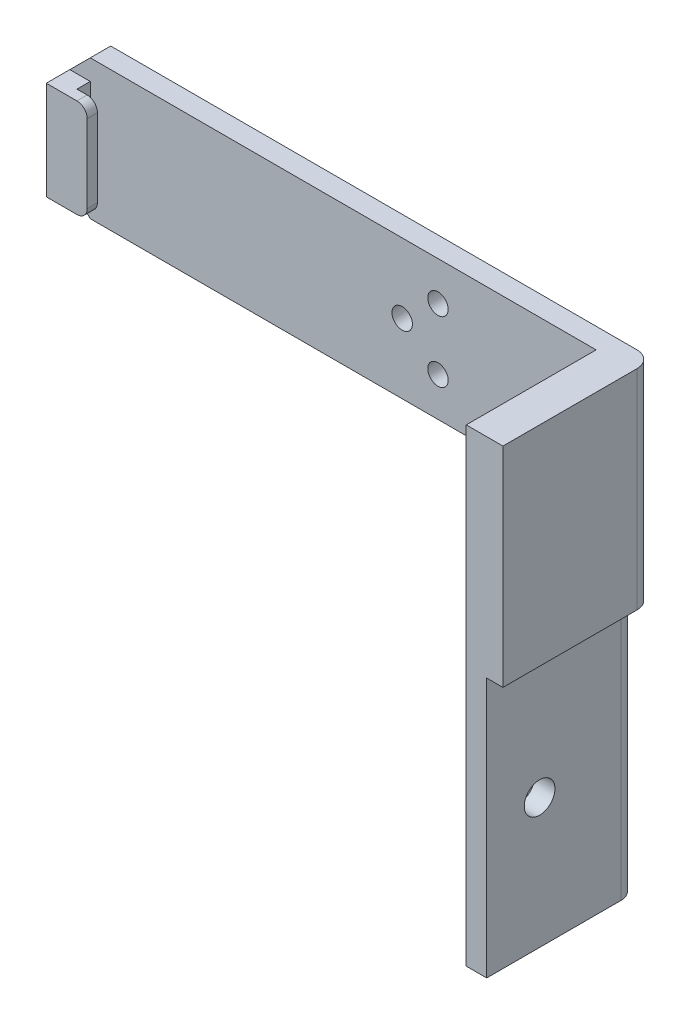
ISO-10303-21;
HEADER;
FILE_DESCRIPTION(('STEP AP214'),'2;1');
FILE_NAME('part.step','',(''),(''),'','','');
FILE_SCHEMA(('AUTOMOTIVE_DESIGN { 1 0 10303 214 1 1 1 1 }'));
ENDSEC;
DATA;
#1=APPLICATION_CONTEXT('core data for automotive mechanical design processes');
#2=APPLICATION_PROTOCOL_DEFINITION('international standard','automotive_design',2000,#1);
#3=PRODUCT_CONTEXT('',#1,'mechanical');
#4=PRODUCT('Part','Part','',(#3));
#5=PRODUCT_RELATED_PRODUCT_CATEGORY('part','',(#4));
#6=PRODUCT_DEFINITION_FORMATION('','',#4);
#7=PRODUCT_DEFINITION_CONTEXT('part definition',#1,'design');
#8=PRODUCT_DEFINITION('design','',#6,#7);
#9=PRODUCT_DEFINITION_SHAPE('','',#8);
#10=(LENGTH_UNIT() NAMED_UNIT(*) SI_UNIT(.MILLI.,.METRE.));
#11=(NAMED_UNIT(*) PLANE_ANGLE_UNIT() SI_UNIT($,.RADIAN.));
#12=(NAMED_UNIT(*) SI_UNIT($,.STERADIAN.) SOLID_ANGLE_UNIT());
#13=UNCERTAINTY_MEASURE_WITH_UNIT(LENGTH_MEASURE(1.E-05),#10,'distance_accuracy_value','');
#14=(GEOMETRIC_REPRESENTATION_CONTEXT(3) GLOBAL_UNCERTAINTY_ASSIGNED_CONTEXT((#13)) GLOBAL_UNIT_ASSIGNED_CONTEXT((#10,
#11,#12)) REPRESENTATION_CONTEXT('',''));
#15=CARTESIAN_POINT('',(0.,0.,0.));
#16=DIRECTION('',(0.,0.,1.));
#17=DIRECTION('',(1.,0.,0.));
#18=AXIS2_PLACEMENT_3D('',#15,#16,#17);
#19=CARTESIAN_POINT('',(106.925,-64.425,4.));
#20=DIRECTION('',(-1.,0.,0.));
#21=DIRECTION('',(0.,0.,1.));
#22=AXIS2_PLACEMENT_3D('',#19,#20,#21);
#23=PLANE('',#22);
#24=CARTESIAN_POINT('',(106.925,-39.025,19.05));
#25=DIRECTION('',(-1.,0.,0.));
#26=DIRECTION('',(0.,0.,1.));
#27=AXIS2_PLACEMENT_3D('',#24,#25,#26);
#28=CIRCLE('',#27,3.);
#29=CARTESIAN_POINT('',(106.925,-39.025,22.05));
#30=VERTEX_POINT('',#29);
#31=EDGE_CURVE('E210',#30,#30,#28,.F.);
#32=ORIENTED_EDGE('',*,*,#31,.F.);
#33=EDGE_LOOP('',(#32));
#34=FACE_BOUND('',#33,.T.);
#35=DIRECTION('',(0.,0.,-1.));
#36=VECTOR('',#35,1.);
#37=CARTESIAN_POINT('',(106.925,-64.425,4.));
#38=LINE('',#37,#36);
#39=CARTESIAN_POINT('',(106.925,-64.425,29.4));
#40=VERTEX_POINT('',#39);
#41=CARTESIAN_POINT('',(106.925,-64.425,3.175));
#42=VERTEX_POINT('',#41);
#43=EDGE_CURVE('E301',#40,#42,#38,.T.);
#44=ORIENTED_EDGE('',*,*,#43,.T.);
#45=DIRECTION('',(0.,1.,0.));
#46=VECTOR('',#45,1.);
#47=CARTESIAN_POINT('',(106.925,-13.625,3.175));
#48=LINE('',#47,#46);
#49=CARTESIAN_POINT('',(106.925,-13.625,3.175));
#50=VERTEX_POINT('',#49);
#51=EDGE_CURVE('E360',#42,#50,#48,.T.);
#52=ORIENTED_EDGE('',*,*,#51,.T.);
#53=DIRECTION('',(0.,0.,-1.));
#54=VECTOR('',#53,1.);
#55=CARTESIAN_POINT('',(106.925,-13.625,29.4));
#56=LINE('',#55,#54);
#57=CARTESIAN_POINT('',(106.925,-13.625,29.4));
#58=VERTEX_POINT('',#57);
#59=EDGE_CURVE('E201',#58,#50,#56,.T.);
#60=ORIENTED_EDGE('',*,*,#59,.F.);
#61=DIRECTION('',(0.,-1.,0.));
#62=VECTOR('',#61,1.);
#63=CARTESIAN_POINT('',(106.925,27.25,29.4));
#64=LINE('',#63,#62);
#65=EDGE_CURVE('E206',#58,#40,#64,.T.);
#66=ORIENTED_EDGE('',*,*,#65,.T.);
#67=EDGE_LOOP('',(#44,#52,#60,#66));
#68=FACE_BOUND('',#67,.T.);
#69=ADVANCED_FACE('F42',(#34,#68),#23,.F.);
#70=CARTESIAN_POINT('',(4.,23.25,6.6));
#71=DIRECTION('',(1.,0.,0.));
#72=DIRECTION('',(0.,1.,0.));
#73=AXIS2_PLACEMENT_3D('',#70,#71,#72);
#74=PLANE('',#73);
#75=DIRECTION('',(0.,0.,-1.));
#76=VECTOR('',#75,1.);
#77=CARTESIAN_POINT('',(4.,23.25,6.6));
#78=LINE('',#77,#76);
#79=CARTESIAN_POINT('',(4.,23.25,6.5999));
#80=VERTEX_POINT('',#79);
#81=CARTESIAN_POINT('',(4.,23.25,4.));
#82=VERTEX_POINT('',#81);
#83=EDGE_CURVE('E246',#80,#82,#78,.T.);
#84=ORIENTED_EDGE('',*,*,#83,.F.);
#85=DIRECTION('',(0.,-1.,0.));
#86=VECTOR('',#85,1.);
#87=CARTESIAN_POINT('',(4.,23.25,6.5999));
#88=LINE('',#87,#86);
#89=CARTESIAN_POINT('',(4.,4.,6.5999));
#90=VERTEX_POINT('',#89);
#91=EDGE_CURVE('E236',#80,#90,#88,.T.);
#92=ORIENTED_EDGE('',*,*,#91,.T.);
#93=DIRECTION('',(0.,0.,-1.));
#94=VECTOR('',#93,1.);
#95=CARTESIAN_POINT('',(4.,4.,6.6));
#96=LINE('',#95,#94);
#97=CARTESIAN_POINT('',(4.,4.,4.));
#98=VERTEX_POINT('',#97);
#99=EDGE_CURVE('E244',#90,#98,#96,.T.);
#100=ORIENTED_EDGE('',*,*,#99,.T.);
#101=DIRECTION('',(0.,-1.,0.));
#102=VECTOR('',#101,1.);
#103=CARTESIAN_POINT('',(4.,0.,4.));
#104=LINE('',#103,#102);
#105=EDGE_CURVE('E320',#82,#98,#104,.T.);
#106=ORIENTED_EDGE('',*,*,#105,.F.);
#107=EDGE_LOOP('',(#84,#92,#100,#106));
#108=FACE_BOUND('',#107,.T.);
#109=ADVANCED_FACE('F387',(#108),#74,.T.);
#110=CARTESIAN_POINT('',(0.,0.,4.));
#111=DIRECTION('',(0.,0.,-1.));
#112=DIRECTION('',(-1.,0.,0.));
#113=AXIS2_PLACEMENT_3D('',#110,#111,#112);
#114=PLANE('',#113);
#115=DIRECTION('',(-1.,0.,0.));
#116=VECTOR('',#115,1.);
#117=CARTESIAN_POINT('',(0.,4.,4.));
#118=LINE('',#117,#116);
#119=CARTESIAN_POINT('',(0.,4.,4.));
#120=VERTEX_POINT('',#119);
#121=EDGE_CURVE('E252',#98,#120,#118,.T.);
#122=ORIENTED_EDGE('',*,*,#121,.T.);
#123=DIRECTION('',(-0.707106781186548,0.707106781186548,0.));
#124=VECTOR('',#123,1.);
#125=CARTESIAN_POINT('',(4.,0.,4.));
#126=LINE('',#125,#124);
#127=CARTESIAN_POINT('',(4.,0.,4.));
#128=VERTEX_POINT('',#127);
#129=EDGE_CURVE('E356',#120,#128,#126,.F.);
#130=ORIENTED_EDGE('',*,*,#129,.T.);
#131=DIRECTION('',(1.,0.,0.));
#132=VECTOR('',#131,1.);
#133=CARTESIAN_POINT('',(0.,0.,4.));
#134=LINE('',#133,#132);
#135=CARTESIAN_POINT('',(81.525,0.,4.));
#136=VERTEX_POINT('',#135);
#137=EDGE_CURVE('E291',#128,#136,#134,.T.);
#138=ORIENTED_EDGE('',*,*,#137,.T.);
#139=DIRECTION('',(0.,-1.,0.));
#140=VECTOR('',#139,1.);
#141=CARTESIAN_POINT('',(81.525,0.,4.));
#142=LINE('',#141,#140);
#143=CARTESIAN_POINT('',(81.525,-64.425,4.));
#144=VERTEX_POINT('',#143);
#145=EDGE_CURVE('E293',#136,#144,#142,.T.);
#146=ORIENTED_EDGE('',*,*,#145,.T.);
#147=DIRECTION('',(1.,0.,0.));
#148=VECTOR('',#147,1.);
#149=CARTESIAN_POINT('',(81.525,-64.425,4.));
#150=LINE('',#149,#148);
#151=CARTESIAN_POINT('',(102.925,-64.425,4.));
#152=VERTEX_POINT('',#151);
#153=EDGE_CURVE('E296',#144,#152,#150,.T.);
#154=ORIENTED_EDGE('',*,*,#153,.T.);
#155=DIRECTION('',(0.,1.,0.));
#156=VECTOR('',#155,1.);
#157=CARTESIAN_POINT('',(102.925,0.,4.));
#158=LINE('',#157,#156);
#159=CARTESIAN_POINT('',(102.925,27.25,4.));
#160=VERTEX_POINT('',#159);
#161=EDGE_CURVE('E268',#152,#160,#158,.T.);
#162=ORIENTED_EDGE('',*,*,#161,.T.);
#163=DIRECTION('',(-1.,0.,0.));
#164=VECTOR('',#163,1.);
#165=CARTESIAN_POINT('',(0.,27.25,4.));
#166=LINE('',#165,#164);
#167=CARTESIAN_POINT('',(3.99999999999999,27.25,4.));
#168=VERTEX_POINT('',#167);
#169=EDGE_CURVE('E298',#160,#168,#166,.T.);
#170=ORIENTED_EDGE('',*,*,#169,.T.);
#171=DIRECTION('',(0.707106781186549,0.707106781186546,0.));
#172=VECTOR('',#171,1.);
#173=CARTESIAN_POINT('',(0.,23.25,4.));
#174=LINE('',#173,#172);
#175=CARTESIAN_POINT('',(0.,23.25,4.));
#176=VERTEX_POINT('',#175);
#177=EDGE_CURVE('E354',#168,#176,#174,.F.);
#178=ORIENTED_EDGE('',*,*,#177,.T.);
#179=DIRECTION('',(1.,0.,0.));
#180=VECTOR('',#179,1.);
#181=CARTESIAN_POINT('',(0.,23.25,4.));
#182=LINE('',#181,#180);
#183=EDGE_CURVE('E243',#176,#82,#182,.T.);
#184=ORIENTED_EDGE('',*,*,#183,.T.);
#185=ORIENTED_EDGE('',*,*,#105,.T.);
#186=EDGE_LOOP('',(#122,#130,#138,#146,#154,#162,#170,#178,#184,#185));
#187=FACE_BOUND('',#186,.T.);
#188=CARTESIAN_POINT('',(72.,19.625,4.));
#189=DIRECTION('',(0.,0.,1.));
#190=DIRECTION('',(1.,0.,0.));
#191=AXIS2_PLACEMENT_3D('',#188,#189,#190);
#192=CIRCLE('',#191,2.);
#193=CARTESIAN_POINT('',(74.,19.625,4.));
#194=VERTEX_POINT('',#193);
#195=EDGE_CURVE('E285',#194,#194,#192,.T.);
#196=ORIENTED_EDGE('',*,*,#195,.F.);
#197=EDGE_LOOP('',(#196));
#198=FACE_BOUND('',#197,.T.);
#199=CARTESIAN_POINT('',(72.,7.625,4.));
#200=DIRECTION('',(0.,0.,1.));
#201=DIRECTION('',(1.,0.,0.));
#202=AXIS2_PLACEMENT_3D('',#199,#200,#201);
#203=CIRCLE('',#202,2.);
#204=CARTESIAN_POINT('',(74.,7.625,4.));
#205=VERTEX_POINT('',#204);
#206=EDGE_CURVE('E279',#205,#205,#203,.T.);
#207=ORIENTED_EDGE('',*,*,#206,.F.);
#208=EDGE_LOOP('',(#207));
#209=FACE_BOUND('',#208,.T.);
#210=CARTESIAN_POINT('',(65.,13.625,4.));
#211=DIRECTION('',(0.,0.,1.));
#212=DIRECTION('',(1.,0.,0.));
#213=AXIS2_PLACEMENT_3D('',#210,#211,#212);
#214=CIRCLE('',#213,2.);
#215=CARTESIAN_POINT('',(67.,13.625,4.));
#216=VERTEX_POINT('',#215);
#217=EDGE_CURVE('E273',#216,#216,#214,.T.);
#218=ORIENTED_EDGE('',*,*,#217,.F.);
#219=EDGE_LOOP('',(#218));
#220=FACE_BOUND('',#219,.T.);
#221=ADVANCED_FACE('F395',(#187,#198,#209,#220),#114,.F.);
#222=CARTESIAN_POINT('',(0.,0.,0.));
#223=DIRECTION('',(0.,0.,-1.));
#224=DIRECTION('',(-1.,0.,0.));
#225=AXIS2_PLACEMENT_3D('',#222,#223,#224);
#226=PLANE('',#225);
#227=CARTESIAN_POINT('',(72.,7.625,0.));
#228=DIRECTION('',(0.,0.,1.));
#229=DIRECTION('',(1.,0.,0.));
#230=AXIS2_PLACEMENT_3D('',#227,#228,#229);
#231=CIRCLE('',#230,2.);
#232=CARTESIAN_POINT('',(74.,7.625,0.));
#233=VERTEX_POINT('',#232);
#234=EDGE_CURVE('E276',#233,#233,#231,.T.);
#235=ORIENTED_EDGE('',*,*,#234,.T.);
#236=EDGE_LOOP('',(#235));
#237=FACE_BOUND('',#236,.T.);
#238=DIRECTION('',(-1.,0.,0.));
#239=VECTOR('',#238,1.);
#240=CARTESIAN_POINT('',(110.1,-13.625,0.));
#241=LINE('',#240,#239);
#242=CARTESIAN_POINT('',(106.925,-13.625,0.));
#243=VERTEX_POINT('',#242);
#244=CARTESIAN_POINT('',(103.75,-13.625,0.));
#245=VERTEX_POINT('',#244);
#246=EDGE_CURVE('E56',#243,#245,#241,.T.);
#247=ORIENTED_EDGE('',*,*,#246,.T.);
#248=DIRECTION('',(0.,1.,0.));
#249=VECTOR('',#248,1.);
#250=CARTESIAN_POINT('',(103.75,-64.425,0.));
#251=LINE('',#250,#249);
#252=CARTESIAN_POINT('',(103.75,-64.425,0.));
#253=VERTEX_POINT('',#252);
#254=EDGE_CURVE('E366',#245,#253,#251,.F.);
#255=ORIENTED_EDGE('',*,*,#254,.T.);
#256=DIRECTION('',(1.,0.,0.));
#257=VECTOR('',#256,1.);
#258=CARTESIAN_POINT('',(81.525,-64.425,0.));
#259=LINE('',#258,#257);
#260=CARTESIAN_POINT('',(81.525,-64.425,0.));
#261=VERTEX_POINT('',#260);
#262=EDGE_CURVE('E308',#261,#253,#259,.T.);
#263=ORIENTED_EDGE('',*,*,#262,.F.);
#264=DIRECTION('',(0.,-1.,0.));
#265=VECTOR('',#264,1.);
#266=CARTESIAN_POINT('',(81.525,0.,0.));
#267=LINE('',#266,#265);
#268=CARTESIAN_POINT('',(81.525,0.,0.));
#269=VERTEX_POINT('',#268);
#270=EDGE_CURVE('E306',#269,#261,#267,.T.);
#271=ORIENTED_EDGE('',*,*,#270,.F.);
#272=DIRECTION('',(1.,0.,0.));
#273=VECTOR('',#272,1.);
#274=CARTESIAN_POINT('',(0.,0.,0.));
#275=LINE('',#274,#273);
#276=CARTESIAN_POINT('',(4.,0.,0.));
#277=VERTEX_POINT('',#276);
#278=EDGE_CURVE('E304',#277,#269,#275,.T.);
#279=ORIENTED_EDGE('',*,*,#278,.F.);
#280=DIRECTION('',(0.707106781186548,-0.707106781186548,0.));
#281=VECTOR('',#280,1.);
#282=CARTESIAN_POINT('',(2.,2.,0.));
#283=LINE('',#282,#281);
#284=CARTESIAN_POINT('',(0.,4.,0.));
#285=VERTEX_POINT('',#284);
#286=EDGE_CURVE('E347',#277,#285,#283,.F.);
#287=ORIENTED_EDGE('',*,*,#286,.T.);
#288=DIRECTION('',(0.,-1.,0.));
#289=VECTOR('',#288,1.);
#290=CARTESIAN_POINT('',(0.,0.,0.));
#291=LINE('',#290,#289);
#292=CARTESIAN_POINT('',(0.,23.25,0.));
#293=VERTEX_POINT('',#292);
#294=EDGE_CURVE('E288',#293,#285,#291,.T.);
#295=ORIENTED_EDGE('',*,*,#294,.F.);
#296=DIRECTION('',(-0.707106781186549,-0.707106781186546,0.));
#297=VECTOR('',#296,1.);
#298=CARTESIAN_POINT('',(-11.625,11.6250000000001,0.));
#299=LINE('',#298,#297);
#300=CARTESIAN_POINT('',(3.99999999999999,27.25,0.));
#301=VERTEX_POINT('',#300);
#302=EDGE_CURVE('E344',#293,#301,#299,.F.);
#303=ORIENTED_EDGE('',*,*,#302,.T.);
#304=DIRECTION('',(-1.,0.,0.));
#305=VECTOR('',#304,1.);
#306=CARTESIAN_POINT('',(0.,27.25,0.));
#307=LINE('',#306,#305);
#308=CARTESIAN_POINT('',(106.925,27.25,0.));
#309=VERTEX_POINT('',#308);
#310=EDGE_CURVE('E294',#309,#301,#307,.T.);
#311=ORIENTED_EDGE('',*,*,#310,.F.);
#312=DIRECTION('',(0.,1.,0.));
#313=VECTOR('',#312,1.);
#314=CARTESIAN_POINT('',(106.925,0.,0.));
#315=LINE('',#314,#313);
#316=EDGE_CURVE('E363',#309,#243,#315,.F.);
#317=ORIENTED_EDGE('',*,*,#316,.T.);
#318=EDGE_LOOP('',(#247,#255,#263,#271,#279,#287,#295,#303,#311,#317));
#319=FACE_BOUND('',#318,.T.);
#320=CARTESIAN_POINT('',(72.,19.625,0.));
#321=DIRECTION('',(0.,0.,1.));
#322=DIRECTION('',(1.,0.,0.));
#323=AXIS2_PLACEMENT_3D('',#320,#321,#322);
#324=CIRCLE('',#323,2.);
#325=CARTESIAN_POINT('',(74.,19.625,0.));
#326=VERTEX_POINT('',#325);
#327=EDGE_CURVE('E282',#326,#326,#324,.T.);
#328=ORIENTED_EDGE('',*,*,#327,.T.);
#329=EDGE_LOOP('',(#328));
#330=FACE_BOUND('',#329,.T.);
#331=CARTESIAN_POINT('',(65.,13.625,0.));
#332=DIRECTION('',(0.,0.,1.));
#333=DIRECTION('',(1.,0.,0.));
#334=AXIS2_PLACEMENT_3D('',#331,#332,#333);
#335=CIRCLE('',#334,2.);
#336=CARTESIAN_POINT('',(67.,13.625,0.));
#337=VERTEX_POINT('',#336);
#338=EDGE_CURVE('E272',#337,#337,#335,.T.);
#339=ORIENTED_EDGE('',*,*,#338,.T.);
#340=EDGE_LOOP('',(#339));
#341=FACE_BOUND('',#340,.T.);
#342=ADVANCED_FACE('F376',(#237,#319,#330,#341),#226,.T.);
#343=CARTESIAN_POINT('',(0.,0.,4.));
#344=DIRECTION('',(1.,0.,0.));
#345=DIRECTION('',(0.,0.,-1.));
#346=AXIS2_PLACEMENT_3D('',#343,#344,#345);
#347=PLANE('',#346);
#348=ORIENTED_EDGE('',*,*,#294,.T.);
#349=DIRECTION('',(0.,0.,1.));
#350=VECTOR('',#349,1.);
#351=CARTESIAN_POINT('',(0.,4.,4.));
#352=LINE('',#351,#350);
#353=EDGE_CURVE('E352',#285,#120,#352,.T.);
#354=ORIENTED_EDGE('',*,*,#353,.T.);
#355=DIRECTION('',(0.,0.,-1.));
#356=VECTOR('',#355,1.);
#357=CARTESIAN_POINT('',(0.,4.,6.6));
#358=LINE('',#357,#356);
#359=CARTESIAN_POINT('',(0.,4.,8.6));
#360=VERTEX_POINT('',#359);
#361=EDGE_CURVE('E240',#360,#120,#358,.T.);
#362=ORIENTED_EDGE('',*,*,#361,.F.);
#363=DIRECTION('',(0.,1.,0.));
#364=VECTOR('',#363,1.);
#365=CARTESIAN_POINT('',(0.,23.25,8.6));
#366=LINE('',#365,#364);
#367=CARTESIAN_POINT('',(0.,23.25,8.6));
#368=VERTEX_POINT('',#367);
#369=EDGE_CURVE('E225',#360,#368,#366,.T.);
#370=ORIENTED_EDGE('',*,*,#369,.T.);
#371=DIRECTION('',(0.,0.,-1.));
#372=VECTOR('',#371,1.);
#373=CARTESIAN_POINT('',(0.,23.25,6.6));
#374=LINE('',#373,#372);
#375=EDGE_CURVE('E239',#368,#176,#374,.T.);
#376=ORIENTED_EDGE('',*,*,#375,.T.);
#377=DIRECTION('',(0.,0.,-1.));
#378=VECTOR('',#377,1.);
#379=CARTESIAN_POINT('',(0.,23.25,4.));
#380=LINE('',#379,#378);
#381=EDGE_CURVE('E349',#176,#293,#380,.T.);
#382=ORIENTED_EDGE('',*,*,#381,.T.);
#383=EDGE_LOOP('',(#348,#354,#362,#370,#376,#382));
#384=FACE_BOUND('',#383,.T.);
#385=ADVANCED_FACE('F414',(#384),#347,.F.);
#386=CARTESIAN_POINT('',(0.,0.,4.));
#387=DIRECTION('',(0.,1.,0.));
#388=DIRECTION('',(0.,0.,1.));
#389=AXIS2_PLACEMENT_3D('',#386,#387,#388);
#390=PLANE('',#389);
#391=ORIENTED_EDGE('',*,*,#137,.F.);
#392=DIRECTION('',(0.,0.,-1.));
#393=VECTOR('',#392,1.);
#394=CARTESIAN_POINT('',(4.,0.,4.));
#395=LINE('',#394,#393);
#396=EDGE_CURVE('E341',#128,#277,#395,.T.);
#397=ORIENTED_EDGE('',*,*,#396,.T.);
#398=ORIENTED_EDGE('',*,*,#278,.T.);
#399=DIRECTION('',(0.,0.,-1.));
#400=VECTOR('',#399,1.);
#401=CARTESIAN_POINT('',(81.525,0.,4.));
#402=LINE('',#401,#400);
#403=EDGE_CURVE('E317',#136,#269,#402,.T.);
#404=ORIENTED_EDGE('',*,*,#403,.F.);
#405=EDGE_LOOP('',(#391,#397,#398,#404));
#406=FACE_BOUND('',#405,.T.);
#407=ADVANCED_FACE('F410',(#406),#390,.F.);
#408=CARTESIAN_POINT('',(81.525,0.,4.));
#409=DIRECTION('',(1.,0.,0.));
#410=DIRECTION('',(0.,0.,-1.));
#411=AXIS2_PLACEMENT_3D('',#408,#409,#410);
#412=PLANE('',#411);
#413=ORIENTED_EDGE('',*,*,#270,.T.);
#414=DIRECTION('',(0.,0.,-1.));
#415=VECTOR('',#414,1.);
#416=CARTESIAN_POINT('',(81.525,-64.425,4.));
#417=LINE('',#416,#415);
#418=EDGE_CURVE('E314',#144,#261,#417,.T.);
#419=ORIENTED_EDGE('',*,*,#418,.F.);
#420=ORIENTED_EDGE('',*,*,#145,.F.);
#421=ORIENTED_EDGE('',*,*,#403,.T.);
#422=EDGE_LOOP('',(#413,#419,#420,#421));
#423=FACE_BOUND('',#422,.T.);
#424=ADVANCED_FACE('F406',(#423),#412,.F.);
#425=CARTESIAN_POINT('',(81.525,-64.425,4.));
#426=DIRECTION('',(0.,1.,0.));
#427=DIRECTION('',(0.,0.,1.));
#428=AXIS2_PLACEMENT_3D('',#425,#426,#427);
#429=PLANE('',#428);
#430=ORIENTED_EDGE('',*,*,#262,.T.);
#431=CARTESIAN_POINT('',(103.75,-64.425,3.175));
#432=DIRECTION('',(0.,1.,0.));
#433=DIRECTION('',(0.,0.,1.));
#434=AXIS2_PLACEMENT_3D('',#431,#432,#433);
#435=CIRCLE('',#434,3.175);
#436=EDGE_CURVE('E368',#253,#42,#435,.F.);
#437=ORIENTED_EDGE('',*,*,#436,.T.);
#438=ORIENTED_EDGE('',*,*,#43,.F.);
#439=DIRECTION('',(-1.,0.,0.));
#440=VECTOR('',#439,1.);
#441=CARTESIAN_POINT('',(106.925,-64.425,29.4));
#442=LINE('',#441,#440);
#443=CARTESIAN_POINT('',(102.925,-64.425,29.4));
#444=VERTEX_POINT('',#443);
#445=EDGE_CURVE('E256',#40,#444,#442,.T.);
#446=ORIENTED_EDGE('',*,*,#445,.T.);
#447=DIRECTION('',(0.,0.,-1.));
#448=VECTOR('',#447,1.);
#449=CARTESIAN_POINT('',(102.925,-64.425,29.4));
#450=LINE('',#449,#448);
#451=EDGE_CURVE('E264',#444,#152,#450,.T.);
#452=ORIENTED_EDGE('',*,*,#451,.T.);
#453=ORIENTED_EDGE('',*,*,#153,.F.);
#454=ORIENTED_EDGE('',*,*,#418,.T.);
#455=EDGE_LOOP('',(#430,#437,#438,#446,#452,#453,#454));
#456=FACE_BOUND('',#455,.T.);
#457=ADVANCED_FACE('F403',(#456),#429,.F.);
#458=CARTESIAN_POINT('',(0.,27.25,4.));
#459=DIRECTION('',(0.,-1.,0.));
#460=DIRECTION('',(0.,0.,-1.));
#461=AXIS2_PLACEMENT_3D('',#458,#459,#460);
#462=PLANE('',#461);
#463=DIRECTION('',(0.,0.,1.));
#464=VECTOR('',#463,1.);
#465=CARTESIAN_POINT('',(110.1,27.25,29.4));
#466=LINE('',#465,#464);
#467=CARTESIAN_POINT('',(110.1,27.25,3.175));
#468=VERTEX_POINT('',#467);
#469=CARTESIAN_POINT('',(110.1,27.25,29.4));
#470=VERTEX_POINT('',#469);
#471=EDGE_CURVE('E192',#468,#470,#466,.T.);
#472=ORIENTED_EDGE('',*,*,#471,.F.);
#473=CARTESIAN_POINT('',(106.925,27.25,3.175));
#474=DIRECTION('',(0.,-1.,0.));
#475=DIRECTION('',(0.,0.,-1.));
#476=AXIS2_PLACEMENT_3D('',#473,#474,#475);
#477=CIRCLE('',#476,3.175);
#478=EDGE_CURVE('E64',#468,#309,#477,.F.);
#479=ORIENTED_EDGE('',*,*,#478,.T.);
#480=ORIENTED_EDGE('',*,*,#310,.T.);
#481=DIRECTION('',(0.,0.,1.));
#482=VECTOR('',#481,1.);
#483=CARTESIAN_POINT('',(3.99999999999999,27.25,4.));
#484=LINE('',#483,#482);
#485=EDGE_CURVE('E358',#301,#168,#484,.T.);
#486=ORIENTED_EDGE('',*,*,#485,.T.);
#487=ORIENTED_EDGE('',*,*,#169,.F.);
#488=DIRECTION('',(0.,0.,-1.));
#489=VECTOR('',#488,1.);
#490=CARTESIAN_POINT('',(102.925,27.25,29.4));
#491=LINE('',#490,#489);
#492=CARTESIAN_POINT('',(102.925,27.25,29.4));
#493=VERTEX_POINT('',#492);
#494=EDGE_CURVE('E265',#493,#160,#491,.T.);
#495=ORIENTED_EDGE('',*,*,#494,.F.);
#496=DIRECTION('',(1.,0.,0.));
#497=VECTOR('',#496,1.);
#498=CARTESIAN_POINT('',(106.925,27.25,29.4));
#499=LINE('',#498,#497);
#500=EDGE_CURVE('E262',#493,#470,#499,.T.);
#501=ORIENTED_EDGE('',*,*,#500,.T.);
#502=EDGE_LOOP('',(#472,#479,#480,#486,#487,#495,#501));
#503=FACE_BOUND('',#502,.T.);
#504=ADVANCED_FACE('F374',(#503),#462,.F.);
#505=CARTESIAN_POINT('',(72.,19.625,4.));
#506=DIRECTION('',(0.,0.,-1.));
#507=DIRECTION('',(-1.,0.,0.));
#508=AXIS2_PLACEMENT_3D('',#505,#506,#507);
#509=CYLINDRICAL_SURFACE('',#508,2.);
#510=ORIENTED_EDGE('',*,*,#195,.T.);
#511=EDGE_LOOP('',(#510));
#512=FACE_BOUND('',#511,.T.);
#513=ORIENTED_EDGE('',*,*,#327,.F.);
#514=EDGE_LOOP('',(#513));
#515=FACE_BOUND('',#514,.T.);
#516=ADVANCED_FACE('F500',(#512,#515),#509,.F.);
#517=CARTESIAN_POINT('',(72.,7.625,4.));
#518=DIRECTION('',(0.,0.,-1.));
#519=DIRECTION('',(-1.,0.,0.));
#520=AXIS2_PLACEMENT_3D('',#517,#518,#519);
#521=CYLINDRICAL_SURFACE('',#520,2.);
#522=ORIENTED_EDGE('',*,*,#206,.T.);
#523=EDGE_LOOP('',(#522));
#524=FACE_BOUND('',#523,.T.);
#525=ORIENTED_EDGE('',*,*,#234,.F.);
#526=EDGE_LOOP('',(#525));
#527=FACE_BOUND('',#526,.T.);
#528=ADVANCED_FACE('F492',(#524,#527),#521,.F.);
#529=CARTESIAN_POINT('',(65.,13.625,4.));
#530=DIRECTION('',(0.,0.,-1.));
#531=DIRECTION('',(-1.,0.,0.));
#532=AXIS2_PLACEMENT_3D('',#529,#530,#531);
#533=CYLINDRICAL_SURFACE('',#532,2.);
#534=ORIENTED_EDGE('',*,*,#217,.T.);
#535=EDGE_LOOP('',(#534));
#536=FACE_BOUND('',#535,.T.);
#537=ORIENTED_EDGE('',*,*,#338,.F.);
#538=EDGE_LOOP('',(#537));
#539=FACE_BOUND('',#538,.T.);
#540=ADVANCED_FACE('F484',(#536,#539),#533,.F.);
#541=CARTESIAN_POINT('',(102.925,27.25,29.4));
#542=DIRECTION('',(-1.,0.,0.));
#543=DIRECTION('',(0.,-1.,0.));
#544=AXIS2_PLACEMENT_3D('',#541,#542,#543);
#545=PLANE('',#544);
#546=CARTESIAN_POINT('',(102.925,-39.025,19.05));
#547=DIRECTION('',(-1.,0.,0.));
#548=DIRECTION('',(0.,0.,1.));
#549=AXIS2_PLACEMENT_3D('',#546,#547,#548);
#550=CIRCLE('',#549,3.);
#551=CARTESIAN_POINT('',(102.925,-39.025,22.05));
#552=VERTEX_POINT('',#551);
#553=EDGE_CURVE('E207',#552,#552,#550,.T.);
#554=ORIENTED_EDGE('',*,*,#553,.F.);
#555=EDGE_LOOP('',(#554));
#556=FACE_BOUND('',#555,.T.);
#557=ORIENTED_EDGE('',*,*,#161,.F.);
#558=ORIENTED_EDGE('',*,*,#451,.F.);
#559=DIRECTION('',(0.,1.,0.));
#560=VECTOR('',#559,1.);
#561=CARTESIAN_POINT('',(102.925,27.25,29.4));
#562=LINE('',#561,#560);
#563=EDGE_CURVE('E259',#444,#493,#562,.T.);
#564=ORIENTED_EDGE('',*,*,#563,.T.);
#565=ORIENTED_EDGE('',*,*,#494,.T.);
#566=EDGE_LOOP('',(#557,#558,#564,#565));
#567=FACE_BOUND('',#566,.T.);
#568=ADVANCED_FACE('F479',(#556,#567),#545,.T.);
#569=CARTESIAN_POINT('',(0.,0.,29.4));
#570=DIRECTION('',(0.,0.,-1.));
#571=DIRECTION('',(-1.,0.,0.));
#572=AXIS2_PLACEMENT_3D('',#569,#570,#571);
#573=PLANE('',#572);
#574=ORIENTED_EDGE('',*,*,#65,.F.);
#575=DIRECTION('',(-1.,0.,0.));
#576=VECTOR('',#575,1.);
#577=CARTESIAN_POINT('',(110.1,-13.625,29.4));
#578=LINE('',#577,#576);
#579=CARTESIAN_POINT('',(110.1,-13.625,29.4));
#580=VERTEX_POINT('',#579);
#581=EDGE_CURVE('E189',#580,#58,#578,.T.);
#582=ORIENTED_EDGE('',*,*,#581,.F.);
#583=DIRECTION('',(0.,-1.,0.));
#584=VECTOR('',#583,1.);
#585=CARTESIAN_POINT('',(110.1,27.25,29.4));
#586=LINE('',#585,#584);
#587=EDGE_CURVE('E193',#470,#580,#586,.T.);
#588=ORIENTED_EDGE('',*,*,#587,.F.);
#589=ORIENTED_EDGE('',*,*,#500,.F.);
#590=ORIENTED_EDGE('',*,*,#563,.F.);
#591=ORIENTED_EDGE('',*,*,#445,.F.);
#592=EDGE_LOOP('',(#574,#582,#588,#589,#590,#591));
#593=FACE_BOUND('',#592,.T.);
#594=ADVANCED_FACE('F204',(#593),#573,.F.);
#595=CARTESIAN_POINT('',(0.,4.,6.6));
#596=DIRECTION('',(0.,-1.,0.));
#597=DIRECTION('',(1.,0.,0.));
#598=AXIS2_PLACEMENT_3D('',#595,#596,#597);
#599=PLANE('',#598);
#600=DIRECTION('',(-1.,0.,0.));
#601=VECTOR('',#600,1.);
#602=CARTESIAN_POINT('',(0.,4.,6.5999));
#603=LINE('',#602,#601);
#604=CARTESIAN_POINT('',(6.,4.,6.5999));
#605=VERTEX_POINT('',#604);
#606=EDGE_CURVE('E223',#605,#90,#603,.T.);
#607=ORIENTED_EDGE('',*,*,#606,.F.);
#608=DIRECTION('',(0.,0.,-1.));
#609=VECTOR('',#608,1.);
#610=CARTESIAN_POINT('',(6.,4.,6.6));
#611=LINE('',#610,#609);
#612=CARTESIAN_POINT('',(6.,4.,8.6));
#613=VERTEX_POINT('',#612);
#614=EDGE_CURVE('E332',#605,#613,#611,.F.);
#615=ORIENTED_EDGE('',*,*,#614,.T.);
#616=DIRECTION('',(-1.,0.,0.));
#617=VECTOR('',#616,1.);
#618=CARTESIAN_POINT('',(0.,4.,8.6));
#619=LINE('',#618,#617);
#620=EDGE_CURVE('E234',#613,#360,#619,.T.);
#621=ORIENTED_EDGE('',*,*,#620,.T.);
#622=ORIENTED_EDGE('',*,*,#361,.T.);
#623=ORIENTED_EDGE('',*,*,#121,.F.);
#624=ORIENTED_EDGE('',*,*,#99,.F.);
#625=EDGE_LOOP('',(#607,#615,#621,#622,#623,#624));
#626=FACE_BOUND('',#625,.T.);
#627=ADVANCED_FACE('F489',(#626),#599,.T.);
#628=CARTESIAN_POINT('',(0.,23.25,6.6));
#629=DIRECTION('',(0.,1.,0.));
#630=DIRECTION('',(0.,0.,1.));
#631=AXIS2_PLACEMENT_3D('',#628,#629,#630);
#632=PLANE('',#631);
#633=DIRECTION('',(1.,0.,0.));
#634=VECTOR('',#633,1.);
#635=CARTESIAN_POINT('',(0.,23.25,8.6));
#636=LINE('',#635,#634);
#637=CARTESIAN_POINT('',(6.,23.25,8.6));
#638=VERTEX_POINT('',#637);
#639=EDGE_CURVE('E228',#368,#638,#636,.T.);
#640=ORIENTED_EDGE('',*,*,#639,.T.);
#641=DIRECTION('',(0.,0.,-1.));
#642=VECTOR('',#641,1.);
#643=CARTESIAN_POINT('',(6.,23.25,6.6));
#644=LINE('',#643,#642);
#645=CARTESIAN_POINT('',(6.,23.25,6.5999));
#646=VERTEX_POINT('',#645);
#647=EDGE_CURVE('E338',#638,#646,#644,.T.);
#648=ORIENTED_EDGE('',*,*,#647,.T.);
#649=DIRECTION('',(1.,0.,0.));
#650=VECTOR('',#649,1.);
#651=CARTESIAN_POINT('',(0.,23.25,6.5999));
#652=LINE('',#651,#650);
#653=EDGE_CURVE('E217',#80,#646,#652,.T.);
#654=ORIENTED_EDGE('',*,*,#653,.F.);
#655=ORIENTED_EDGE('',*,*,#83,.T.);
#656=ORIENTED_EDGE('',*,*,#183,.F.);
#657=ORIENTED_EDGE('',*,*,#375,.F.);
#658=EDGE_LOOP('',(#640,#648,#654,#655,#656,#657));
#659=FACE_BOUND('',#658,.T.);
#660=ADVANCED_FACE('F458',(#659),#632,.T.);
#661=CARTESIAN_POINT('',(8.,23.25,8.6));
#662=DIRECTION('',(1.,0.,0.));
#663=DIRECTION('',(0.,1.,0.));
#664=AXIS2_PLACEMENT_3D('',#661,#662,#663);
#665=PLANE('',#664);
#666=DIRECTION('',(0.,-1.,0.));
#667=VECTOR('',#666,1.);
#668=CARTESIAN_POINT('',(8.,23.25,8.6));
#669=LINE('',#668,#667);
#670=CARTESIAN_POINT('',(8.,21.25,8.6));
#671=VERTEX_POINT('',#670);
#672=CARTESIAN_POINT('',(8.,6.,8.6));
#673=VERTEX_POINT('',#672);
#674=EDGE_CURVE('E231',#671,#673,#669,.T.);
#675=ORIENTED_EDGE('',*,*,#674,.T.);
#676=DIRECTION('',(0.,0.,-1.));
#677=VECTOR('',#676,1.);
#678=CARTESIAN_POINT('',(8.,6.,8.6));
#679=LINE('',#678,#677);
#680=CARTESIAN_POINT('',(8.,6.,6.5999));
#681=VERTEX_POINT('',#680);
#682=EDGE_CURVE('E325',#673,#681,#679,.T.);
#683=ORIENTED_EDGE('',*,*,#682,.T.);
#684=DIRECTION('',(0.,-1.,0.));
#685=VECTOR('',#684,1.);
#686=CARTESIAN_POINT('',(8.,23.25,6.5999));
#687=LINE('',#686,#685);
#688=CARTESIAN_POINT('',(8.,21.25,6.5999));
#689=VERTEX_POINT('',#688);
#690=EDGE_CURVE('E220',#689,#681,#687,.T.);
#691=ORIENTED_EDGE('',*,*,#690,.F.);
#692=DIRECTION('',(0.,0.,-1.));
#693=VECTOR('',#692,1.);
#694=CARTESIAN_POINT('',(8.,21.25,8.6));
#695=LINE('',#694,#693);
#696=EDGE_CURVE('E323',#689,#671,#695,.F.);
#697=ORIENTED_EDGE('',*,*,#696,.T.);
#698=EDGE_LOOP('',(#675,#683,#691,#697));
#699=FACE_BOUND('',#698,.T.);
#700=ADVANCED_FACE('F596',(#699),#665,.T.);
#701=CARTESIAN_POINT('',(0.,0.,8.6));
#702=DIRECTION('',(0.,0.,1.));
#703=DIRECTION('',(1.,0.,0.));
#704=AXIS2_PLACEMENT_3D('',#701,#702,#703);
#705=PLANE('',#704);
#706=ORIENTED_EDGE('',*,*,#620,.F.);
#707=CARTESIAN_POINT('',(6.,6.,8.6));
#708=DIRECTION('',(0.,0.,1.));
#709=DIRECTION('',(1.,0.,0.));
#710=AXIS2_PLACEMENT_3D('',#707,#708,#709);
#711=CIRCLE('',#710,2.);
#712=EDGE_CURVE('E336',#613,#673,#711,.T.);
#713=ORIENTED_EDGE('',*,*,#712,.T.);
#714=ORIENTED_EDGE('',*,*,#674,.F.);
#715=CARTESIAN_POINT('',(6.,21.25,8.6));
#716=DIRECTION('',(0.,0.,1.));
#717=DIRECTION('',(1.,0.,0.));
#718=AXIS2_PLACEMENT_3D('',#715,#716,#717);
#719=CIRCLE('',#718,2.);
#720=EDGE_CURVE('E334',#671,#638,#719,.T.);
#721=ORIENTED_EDGE('',*,*,#720,.T.);
#722=ORIENTED_EDGE('',*,*,#639,.F.);
#723=ORIENTED_EDGE('',*,*,#369,.F.);
#724=EDGE_LOOP('',(#706,#713,#714,#721,#722,#723));
#725=FACE_BOUND('',#724,.T.);
#726=ADVANCED_FACE('F587',(#725),#705,.T.);
#727=CARTESIAN_POINT('',(0.,0.,6.5999));
#728=DIRECTION('',(0.,0.,1.));
#729=DIRECTION('',(1.,0.,0.));
#730=AXIS2_PLACEMENT_3D('',#727,#728,#729);
#731=PLANE('',#730);
#732=ORIENTED_EDGE('',*,*,#690,.T.);
#733=CARTESIAN_POINT('',(6.,6.,6.5999));
#734=DIRECTION('',(0.,0.,1.));
#735=DIRECTION('',(1.,0.,0.));
#736=AXIS2_PLACEMENT_3D('',#733,#734,#735);
#737=CIRCLE('',#736,2.);
#738=EDGE_CURVE('E330',#681,#605,#737,.F.);
#739=ORIENTED_EDGE('',*,*,#738,.T.);
#740=ORIENTED_EDGE('',*,*,#606,.T.);
#741=ORIENTED_EDGE('',*,*,#91,.F.);
#742=ORIENTED_EDGE('',*,*,#653,.T.);
#743=CARTESIAN_POINT('',(6.,21.25,6.5999));
#744=DIRECTION('',(0.,0.,1.));
#745=DIRECTION('',(1.,0.,0.));
#746=AXIS2_PLACEMENT_3D('',#743,#744,#745);
#747=CIRCLE('',#746,2.);
#748=EDGE_CURVE('E328',#646,#689,#747,.F.);
#749=ORIENTED_EDGE('',*,*,#748,.T.);
#750=EDGE_LOOP('',(#732,#739,#740,#741,#742,#749));
#751=FACE_BOUND('',#750,.T.);
#752=ADVANCED_FACE('F423',(#751),#731,.F.);
#753=CARTESIAN_POINT('',(6.,6.,8.6));
#754=DIRECTION('',(0.,0.,-1.));
#755=DIRECTION('',(-1.,0.,0.));
#756=AXIS2_PLACEMENT_3D('',#753,#754,#755);
#757=CYLINDRICAL_SURFACE('',#756,2.);
#758=ORIENTED_EDGE('',*,*,#712,.F.);
#759=ORIENTED_EDGE('',*,*,#614,.F.);
#760=ORIENTED_EDGE('',*,*,#738,.F.);
#761=ORIENTED_EDGE('',*,*,#682,.F.);
#762=EDGE_LOOP('',(#758,#759,#760,#761));
#763=FACE_BOUND('',#762,.T.);
#764=ADVANCED_FACE('F419',(#763),#757,.T.);
#765=CARTESIAN_POINT('',(6.,21.25,6.6));
#766=DIRECTION('',(0.,0.,-1.));
#767=DIRECTION('',(-1.,0.,0.));
#768=AXIS2_PLACEMENT_3D('',#765,#766,#767);
#769=CYLINDRICAL_SURFACE('',#768,2.);
#770=ORIENTED_EDGE('',*,*,#720,.F.);
#771=ORIENTED_EDGE('',*,*,#696,.F.);
#772=ORIENTED_EDGE('',*,*,#748,.F.);
#773=ORIENTED_EDGE('',*,*,#647,.F.);
#774=EDGE_LOOP('',(#770,#771,#772,#773));
#775=FACE_BOUND('',#774,.T.);
#776=ADVANCED_FACE('F422',(#775),#769,.T.);
#777=CARTESIAN_POINT('',(4.,0.,4.));
#778=DIRECTION('',(0.707106781186547,0.707106781186547,0.));
#779=DIRECTION('',(0.,0.,-1.));
#780=AXIS2_PLACEMENT_3D('',#777,#778,#779);
#781=PLANE('',#780);
#782=ORIENTED_EDGE('',*,*,#129,.F.);
#783=ORIENTED_EDGE('',*,*,#353,.F.);
#784=ORIENTED_EDGE('',*,*,#286,.F.);
#785=ORIENTED_EDGE('',*,*,#396,.F.);
#786=EDGE_LOOP('',(#782,#783,#784,#785));
#787=FACE_BOUND('',#786,.T.);
#788=ADVANCED_FACE('F427',(#787),#781,.F.);
#789=CARTESIAN_POINT('',(0.,23.25,4.));
#790=DIRECTION('',(0.707106781186546,-0.707106781186549,0.));
#791=DIRECTION('',(0.,0.,-1.));
#792=AXIS2_PLACEMENT_3D('',#789,#790,#791);
#793=PLANE('',#792);
#794=ORIENTED_EDGE('',*,*,#177,.F.);
#795=ORIENTED_EDGE('',*,*,#485,.F.);
#796=ORIENTED_EDGE('',*,*,#302,.F.);
#797=ORIENTED_EDGE('',*,*,#381,.F.);
#798=EDGE_LOOP('',(#794,#795,#796,#797));
#799=FACE_BOUND('',#798,.T.);
#800=ADVANCED_FACE('F435',(#799),#793,.F.);
#801=CARTESIAN_POINT('',(106.926,-39.025,19.05));
#802=DIRECTION('',(-1.,0.,0.));
#803=DIRECTION('',(0.,0.,1.));
#804=AXIS2_PLACEMENT_3D('',#801,#802,#803);
#805=CYLINDRICAL_SURFACE('',#804,3.);
#806=ORIENTED_EDGE('',*,*,#553,.T.);
#807=EDGE_LOOP('',(#806));
#808=FACE_BOUND('',#807,.T.);
#809=ORIENTED_EDGE('',*,*,#31,.T.);
#810=EDGE_LOOP('',(#809));
#811=FACE_BOUND('',#810,.T.);
#812=ADVANCED_FACE('F440',(#808,#811),#805,.F.);
#813=CARTESIAN_POINT('',(110.1,-13.625,29.4));
#814=DIRECTION('',(0.,1.,0.));
#815=DIRECTION('',(0.,0.,1.));
#816=AXIS2_PLACEMENT_3D('',#813,#814,#815);
#817=PLANE('',#816);
#818=ORIENTED_EDGE('',*,*,#59,.T.);
#819=CARTESIAN_POINT('',(103.75,-13.625,3.175));
#820=DIRECTION('',(0.,1.,0.));
#821=DIRECTION('',(0.,0.,1.));
#822=AXIS2_PLACEMENT_3D('',#819,#820,#821);
#823=CIRCLE('',#822,3.175);
#824=EDGE_CURVE('E11',#50,#245,#823,.T.);
#825=ORIENTED_EDGE('',*,*,#824,.T.);
#826=ORIENTED_EDGE('',*,*,#246,.F.);
#827=CARTESIAN_POINT('',(106.925,-13.625,3.175));
#828=DIRECTION('',(0.,1.,0.));
#829=DIRECTION('',(0.,0.,1.));
#830=AXIS2_PLACEMENT_3D('',#827,#828,#829);
#831=CIRCLE('',#830,3.175);
#832=CARTESIAN_POINT('',(110.1,-13.625,3.175));
#833=VERTEX_POINT('',#832);
#834=EDGE_CURVE('E50',#243,#833,#831,.F.);
#835=ORIENTED_EDGE('',*,*,#834,.T.);
#836=DIRECTION('',(0.,0.,-1.));
#837=VECTOR('',#836,1.);
#838=CARTESIAN_POINT('',(110.1,-13.625,29.4));
#839=LINE('',#838,#837);
#840=EDGE_CURVE('E184',#580,#833,#839,.T.);
#841=ORIENTED_EDGE('',*,*,#840,.F.);
#842=ORIENTED_EDGE('',*,*,#581,.T.);
#843=EDGE_LOOP('',(#818,#825,#826,#835,#841,#842));
#844=FACE_BOUND('',#843,.T.);
#845=ADVANCED_FACE('F187',(#844),#817,.F.);
#846=CARTESIAN_POINT('',(110.1,0.,0.));
#847=DIRECTION('',(1.,0.,0.));
#848=DIRECTION('',(0.,0.,-1.));
#849=AXIS2_PLACEMENT_3D('',#846,#847,#848);
#850=PLANE('',#849);
#851=ORIENTED_EDGE('',*,*,#840,.T.);
#852=DIRECTION('',(0.,1.,0.));
#853=VECTOR('',#852,1.);
#854=CARTESIAN_POINT('',(110.1,0.,3.175));
#855=LINE('',#854,#853);
#856=EDGE_CURVE('E370',#833,#468,#855,.T.);
#857=ORIENTED_EDGE('',*,*,#856,.T.);
#858=ORIENTED_EDGE('',*,*,#471,.T.);
#859=ORIENTED_EDGE('',*,*,#587,.T.);
#860=EDGE_LOOP('',(#851,#857,#858,#859));
#861=FACE_BOUND('',#860,.T.);
#862=ADVANCED_FACE('F196',(#861),#850,.T.);
#863=CARTESIAN_POINT('',(103.75,-64.425,3.175));
#864=DIRECTION('',(0.,-1.,0.));
#865=DIRECTION('',(0.,0.,-1.));
#866=AXIS2_PLACEMENT_3D('',#863,#864,#865);
#867=CYLINDRICAL_SURFACE('',#866,3.175);
#868=ORIENTED_EDGE('',*,*,#436,.F.);
#869=ORIENTED_EDGE('',*,*,#254,.F.);
#870=ORIENTED_EDGE('',*,*,#824,.F.);
#871=ORIENTED_EDGE('',*,*,#51,.F.);
#872=EDGE_LOOP('',(#868,#869,#870,#871));
#873=FACE_BOUND('',#872,.T.);
#874=ADVANCED_FACE('F381',(#873),#867,.T.);
#875=CARTESIAN_POINT('',(106.925,0.,3.175));
#876=DIRECTION('',(0.,1.,0.));
#877=DIRECTION('',(0.,0.,1.));
#878=AXIS2_PLACEMENT_3D('',#875,#876,#877);
#879=CYLINDRICAL_SURFACE('',#878,3.175);
#880=ORIENTED_EDGE('',*,*,#834,.F.);
#881=ORIENTED_EDGE('',*,*,#316,.F.);
#882=ORIENTED_EDGE('',*,*,#478,.F.);
#883=ORIENTED_EDGE('',*,*,#856,.F.);
#884=EDGE_LOOP('',(#880,#881,#882,#883));
#885=FACE_BOUND('',#884,.T.);
#886=ADVANCED_FACE('F44',(#885),#879,.T.);
#887=CLOSED_SHELL('',(#69,#109,#221,#342,#385,#407,#424,#457,#504,#516,#528,#540,#568,#594,#627,
#660,#700,#726,#752,#764,#776,#788,#800,#812,#845,#862,#874,#886));
#888=MANIFOLD_SOLID_BREP('B2',#887);
#889=ADVANCED_BREP_SHAPE_REPRESENTATION('',(#18,#888),#14);
#890=SHAPE_DEFINITION_REPRESENTATION(#9,#889);
ENDSEC;
END-ISO-10303-21;
